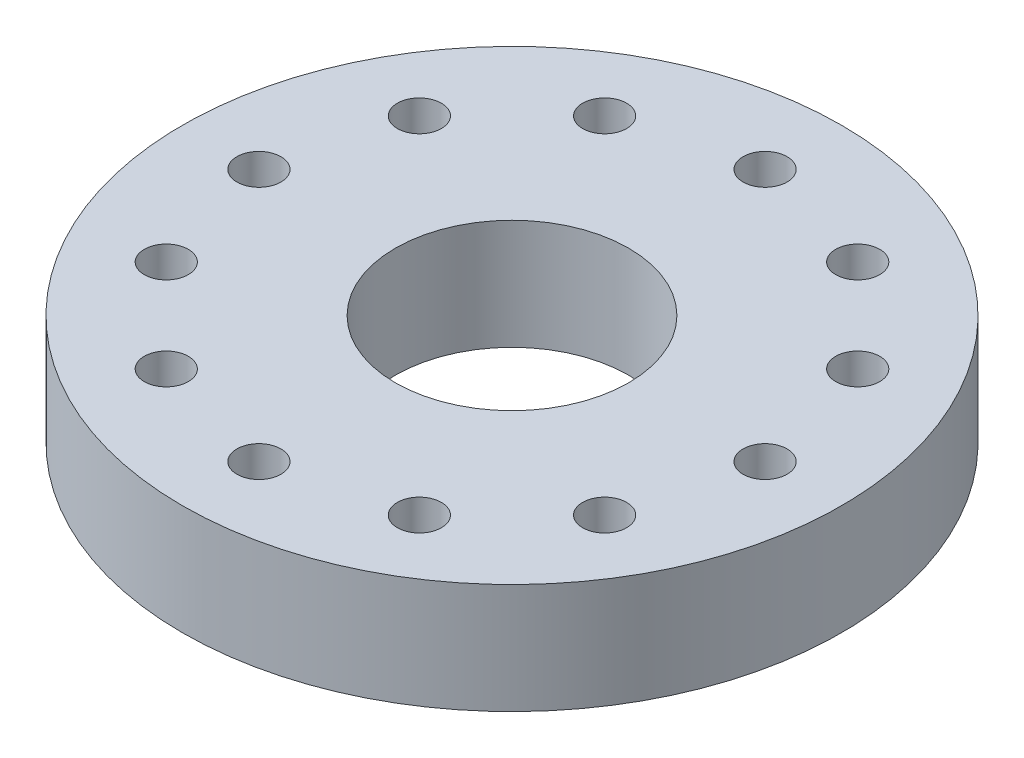
ISO-10303-21;
HEADER;
FILE_DESCRIPTION(('STEP AP214'),'2;1');
FILE_NAME('part.step','',(''),(''),'','','');
FILE_SCHEMA(('AUTOMOTIVE_DESIGN { 1 0 10303 214 1 1 1 1 }'));
ENDSEC;
DATA;
#1=APPLICATION_CONTEXT('core data for automotive mechanical design processes');
#2=APPLICATION_PROTOCOL_DEFINITION('international standard','automotive_design',2000,#1);
#3=PRODUCT_CONTEXT('',#1,'mechanical');
#4=PRODUCT('Part','Part','',(#3));
#5=PRODUCT_RELATED_PRODUCT_CATEGORY('part','',(#4));
#6=PRODUCT_DEFINITION_FORMATION('','',#4);
#7=PRODUCT_DEFINITION_CONTEXT('part definition',#1,'design');
#8=PRODUCT_DEFINITION('design','',#6,#7);
#9=PRODUCT_DEFINITION_SHAPE('','',#8);
#10=(LENGTH_UNIT() NAMED_UNIT(*) SI_UNIT(.MILLI.,.METRE.));
#11=(NAMED_UNIT(*) PLANE_ANGLE_UNIT() SI_UNIT($,.RADIAN.));
#12=(NAMED_UNIT(*) SI_UNIT($,.STERADIAN.) SOLID_ANGLE_UNIT());
#13=UNCERTAINTY_MEASURE_WITH_UNIT(LENGTH_MEASURE(1.E-05),#10,'distance_accuracy_value','');
#14=(GEOMETRIC_REPRESENTATION_CONTEXT(3) GLOBAL_UNCERTAINTY_ASSIGNED_CONTEXT((#13)) GLOBAL_UNIT_ASSIGNED_CONTEXT((#10,
#11,#12)) REPRESENTATION_CONTEXT('',''));
#15=CARTESIAN_POINT('',(0.,0.,0.));
#16=DIRECTION('',(0.,0.,1.));
#17=DIRECTION('',(1.,0.,0.));
#18=AXIS2_PLACEMENT_3D('',#15,#16,#17);
#19=CARTESIAN_POINT('',(0.,10.,0.));
#20=DIRECTION('',(0.,1.,0.));
#21=DIRECTION('',(0.,0.,1.));
#22=AXIS2_PLACEMENT_3D('',#19,#20,#21);
#23=PLANE('',#22);
#24=CARTESIAN_POINT('',(-19.9185842870416,10.,-11.499999999999));
#25=DIRECTION('',(0.,1.,0.));
#26=DIRECTION('',(0.,0.,1.));
#27=AXIS2_PLACEMENT_3D('',#24,#25,#26);
#28=CIRCLE('',#27,2.);
#29=CARTESIAN_POINT('',(-19.9185842870416,10.,-9.49999999999905));
#30=VERTEX_POINT('',#29);
#31=EDGE_CURVE('E107',#30,#30,#28,.T.);
#32=ORIENTED_EDGE('',*,*,#31,.F.);
#33=EDGE_LOOP('',(#32));
#34=FACE_BOUND('',#33,.T.);
#35=CARTESIAN_POINT('',(-19.9185842870405,10.,11.5000000000009));
#36=DIRECTION('',(0.,1.,0.));
#37=DIRECTION('',(0.,0.,1.));
#38=AXIS2_PLACEMENT_3D('',#35,#36,#37);
#39=CIRCLE('',#38,2.);
#40=CARTESIAN_POINT('',(-19.9185842870405,10.,13.5000000000009));
#41=VERTEX_POINT('',#40);
#42=EDGE_CURVE('E95',#41,#41,#39,.T.);
#43=ORIENTED_EDGE('',*,*,#42,.F.);
#44=EDGE_LOOP('',(#43));
#45=FACE_BOUND('',#44,.T.);
#46=CARTESIAN_POINT('',(2.16458606171264E-12,10.,23.));
#47=DIRECTION('',(0.,1.,0.));
#48=DIRECTION('',(0.,0.,1.));
#49=AXIS2_PLACEMENT_3D('',#46,#47,#48);
#50=CIRCLE('',#49,2.);
#51=CARTESIAN_POINT('',(2.16458606171264E-12,10.,25.));
#52=VERTEX_POINT('',#51);
#53=EDGE_CURVE('E83',#52,#52,#50,.T.);
#54=ORIENTED_EDGE('',*,*,#53,.F.);
#55=EDGE_LOOP('',(#54));
#56=FACE_BOUND('',#55,.T.);
#57=CARTESIAN_POINT('',(19.9185842870437,10.,11.4999999999991));
#58=DIRECTION('',(0.,1.,0.));
#59=DIRECTION('',(0.,0.,1.));
#60=AXIS2_PLACEMENT_3D('',#57,#58,#59);
#61=CIRCLE('',#60,2.);
#62=CARTESIAN_POINT('',(19.9185842870437,10.,13.4999999999991));
#63=VERTEX_POINT('',#62);
#64=EDGE_CURVE('E71',#63,#63,#61,.T.);
#65=ORIENTED_EDGE('',*,*,#64,.F.);
#66=EDGE_LOOP('',(#65));
#67=FACE_BOUND('',#66,.T.);
#68=CARTESIAN_POINT('',(19.9185842870426,10.,-11.5000000000009));
#69=DIRECTION('',(0.,1.,0.));
#70=DIRECTION('',(0.,0.,1.));
#71=AXIS2_PLACEMENT_3D('',#68,#69,#70);
#72=CIRCLE('',#71,2.);
#73=CARTESIAN_POINT('',(19.9185842870426,10.,-9.50000000000093));
#74=VERTEX_POINT('',#73);
#75=EDGE_CURVE('E59',#74,#74,#72,.T.);
#76=ORIENTED_EDGE('',*,*,#75,.F.);
#77=EDGE_LOOP('',(#76));
#78=FACE_BOUND('',#77,.T.);
#79=CARTESIAN_POINT('',(0.,10.,0.));
#80=DIRECTION('',(0.,1.,0.));
#81=DIRECTION('',(0.,0.,1.));
#82=AXIS2_PLACEMENT_3D('',#79,#80,#81);
#83=CIRCLE('',#82,10.6);
#84=CARTESIAN_POINT('',(0.,10.,10.6));
#85=VERTEX_POINT('',#84);
#86=EDGE_CURVE('E47',#85,#85,#83,.T.);
#87=ORIENTED_EDGE('',*,*,#86,.F.);
#88=EDGE_LOOP('',(#87));
#89=FACE_BOUND('',#88,.T.);
#90=CARTESIAN_POINT('',(0.,10.,0.));
#91=DIRECTION('',(0.,1.,0.));
#92=DIRECTION('',(0.,0.,1.));
#93=AXIS2_PLACEMENT_3D('',#90,#91,#92);
#94=CIRCLE('',#93,29.95);
#95=CARTESIAN_POINT('',(0.,10.,29.95));
#96=VERTEX_POINT('',#95);
#97=EDGE_CURVE('E10',#96,#96,#94,.T.);
#98=ORIENTED_EDGE('',*,*,#97,.T.);
#99=EDGE_LOOP('',(#98));
#100=FACE_BOUND('',#99,.T.);
#101=CARTESIAN_POINT('',(0.,10.,-23.));
#102=DIRECTION('',(0.,1.,0.));
#103=DIRECTION('',(0.,0.,1.));
#104=AXIS2_PLACEMENT_3D('',#101,#102,#103);
#105=CIRCLE('',#104,2.);
#106=CARTESIAN_POINT('',(0.,10.,-21.));
#107=VERTEX_POINT('',#106);
#108=EDGE_CURVE('E42',#107,#107,#105,.T.);
#109=ORIENTED_EDGE('',*,*,#108,.F.);
#110=EDGE_LOOP('',(#109));
#111=FACE_BOUND('',#110,.T.);
#112=CARTESIAN_POINT('',(11.5000000000003,10.,-19.918584287043));
#113=DIRECTION('',(0.,1.,0.));
#114=DIRECTION('',(0.,0.,1.));
#115=AXIS2_PLACEMENT_3D('',#112,#113,#114);
#116=CIRCLE('',#115,2.);
#117=CARTESIAN_POINT('',(11.5000000000003,10.,-17.918584287043));
#118=VERTEX_POINT('',#117);
#119=EDGE_CURVE('E53',#118,#118,#116,.T.);
#120=ORIENTED_EDGE('',*,*,#119,.F.);
#121=EDGE_LOOP('',(#120));
#122=FACE_BOUND('',#121,.T.);
#123=CARTESIAN_POINT('',(23.0000000000011,10.,-1.08229303085632E-12));
#124=DIRECTION('',(0.,1.,0.));
#125=DIRECTION('',(0.,0.,1.));
#126=AXIS2_PLACEMENT_3D('',#123,#124,#125);
#127=CIRCLE('',#126,2.);
#128=CARTESIAN_POINT('',(23.0000000000011,10.,1.99999999999892));
#129=VERTEX_POINT('',#128);
#130=EDGE_CURVE('E65',#129,#129,#127,.T.);
#131=ORIENTED_EDGE('',*,*,#130,.F.);
#132=EDGE_LOOP('',(#131));
#133=FACE_BOUND('',#132,.T.);
#134=CARTESIAN_POINT('',(11.500000000002,10.,19.9185842870415));
#135=DIRECTION('',(0.,1.,0.));
#136=DIRECTION('',(0.,0.,1.));
#137=AXIS2_PLACEMENT_3D('',#134,#135,#136);
#138=CIRCLE('',#137,2.);
#139=CARTESIAN_POINT('',(11.500000000002,10.,21.9185842870415));
#140=VERTEX_POINT('',#139);
#141=EDGE_CURVE('E77',#140,#140,#138,.T.);
#142=ORIENTED_EDGE('',*,*,#141,.F.);
#143=EDGE_LOOP('',(#142));
#144=FACE_BOUND('',#143,.T.);
#145=CARTESIAN_POINT('',(-11.499999999998,10.,19.9185842870426));
#146=DIRECTION('',(0.,1.,0.));
#147=DIRECTION('',(0.,0.,1.));
#148=AXIS2_PLACEMENT_3D('',#145,#146,#147);
#149=CIRCLE('',#148,2.);
#150=CARTESIAN_POINT('',(-11.499999999998,10.,21.9185842870426));
#151=VERTEX_POINT('',#150);
#152=EDGE_CURVE('E89',#151,#151,#149,.T.);
#153=ORIENTED_EDGE('',*,*,#152,.F.);
#154=EDGE_LOOP('',(#153));
#155=FACE_BOUND('',#154,.T.);
#156=CARTESIAN_POINT('',(-22.9999999999989,10.,1.08510971849436E-12));
#157=DIRECTION('',(0.,1.,0.));
#158=DIRECTION('',(0.,0.,1.));
#159=AXIS2_PLACEMENT_3D('',#156,#157,#158);
#160=CIRCLE('',#159,2.);
#161=CARTESIAN_POINT('',(-22.9999999999989,10.,2.00000000000109));
#162=VERTEX_POINT('',#161);
#163=EDGE_CURVE('E101',#162,#162,#160,.T.);
#164=ORIENTED_EDGE('',*,*,#163,.F.);
#165=EDGE_LOOP('',(#164));
#166=FACE_BOUND('',#165,.T.);
#167=CARTESIAN_POINT('',(-11.4999999999999,10.,-19.9185842870415));
#168=DIRECTION('',(0.,1.,0.));
#169=DIRECTION('',(0.,0.,1.));
#170=AXIS2_PLACEMENT_3D('',#167,#168,#169);
#171=CIRCLE('',#170,2.);
#172=CARTESIAN_POINT('',(-11.4999999999999,10.,-17.9185842870415));
#173=VERTEX_POINT('',#172);
#174=EDGE_CURVE('E113',#173,#173,#171,.T.);
#175=ORIENTED_EDGE('',*,*,#174,.F.);
#176=EDGE_LOOP('',(#175));
#177=FACE_BOUND('',#176,.T.);
#178=ADVANCED_FACE('F31',(#34,#45,#56,#67,#78,#89,#100,#111,#122,#133,#144,#155,#166,#177),#23,.T.);
#179=CARTESIAN_POINT('',(0.,0.,0.));
#180=DIRECTION('',(0.,1.,0.));
#181=DIRECTION('',(0.,0.,1.));
#182=AXIS2_PLACEMENT_3D('',#179,#180,#181);
#183=PLANE('',#182);
#184=CARTESIAN_POINT('',(0.,0.,0.));
#185=DIRECTION('',(0.,1.,0.));
#186=DIRECTION('',(0.,0.,1.));
#187=AXIS2_PLACEMENT_3D('',#184,#185,#186);
#188=CIRCLE('',#187,29.95);
#189=CARTESIAN_POINT('',(0.,0.,29.95));
#190=VERTEX_POINT('',#189);
#191=EDGE_CURVE('E35',#190,#190,#188,.T.);
#192=ORIENTED_EDGE('',*,*,#191,.F.);
#193=EDGE_LOOP('',(#192));
#194=FACE_BOUND('',#193,.T.);
#195=CARTESIAN_POINT('',(0.,0.,-23.));
#196=DIRECTION('',(0.,1.,0.));
#197=DIRECTION('',(0.,0.,1.));
#198=AXIS2_PLACEMENT_3D('',#195,#196,#197);
#199=CIRCLE('',#198,2.);
#200=CARTESIAN_POINT('',(0.,0.,-21.));
#201=VERTEX_POINT('',#200);
#202=EDGE_CURVE('E44',#201,#201,#199,.T.);
#203=ORIENTED_EDGE('',*,*,#202,.T.);
#204=EDGE_LOOP('',(#203));
#205=FACE_BOUND('',#204,.T.);
#206=CARTESIAN_POINT('',(0.,0.,0.));
#207=DIRECTION('',(0.,1.,0.));
#208=DIRECTION('',(0.,0.,1.));
#209=AXIS2_PLACEMENT_3D('',#206,#207,#208);
#210=CIRCLE('',#209,10.6);
#211=CARTESIAN_POINT('',(0.,0.,10.6));
#212=VERTEX_POINT('',#211);
#213=EDGE_CURVE('E50',#212,#212,#210,.T.);
#214=ORIENTED_EDGE('',*,*,#213,.T.);
#215=EDGE_LOOP('',(#214));
#216=FACE_BOUND('',#215,.T.);
#217=CARTESIAN_POINT('',(11.5000000000003,0.,-19.918584287043));
#218=DIRECTION('',(0.,1.,0.));
#219=DIRECTION('',(0.,0.,1.));
#220=AXIS2_PLACEMENT_3D('',#217,#218,#219);
#221=CIRCLE('',#220,2.);
#222=CARTESIAN_POINT('',(11.5000000000003,0.,-17.918584287043));
#223=VERTEX_POINT('',#222);
#224=EDGE_CURVE('E56',#223,#223,#221,.T.);
#225=ORIENTED_EDGE('',*,*,#224,.T.);
#226=EDGE_LOOP('',(#225));
#227=FACE_BOUND('',#226,.T.);
#228=CARTESIAN_POINT('',(19.9185842870426,0.,-11.5000000000009));
#229=DIRECTION('',(0.,1.,0.));
#230=DIRECTION('',(0.,0.,1.));
#231=AXIS2_PLACEMENT_3D('',#228,#229,#230);
#232=CIRCLE('',#231,2.);
#233=CARTESIAN_POINT('',(19.9185842870426,0.,-9.50000000000093));
#234=VERTEX_POINT('',#233);
#235=EDGE_CURVE('E62',#234,#234,#232,.T.);
#236=ORIENTED_EDGE('',*,*,#235,.T.);
#237=EDGE_LOOP('',(#236));
#238=FACE_BOUND('',#237,.T.);
#239=CARTESIAN_POINT('',(23.0000000000011,0.,-1.08229303085632E-12));
#240=DIRECTION('',(0.,1.,0.));
#241=DIRECTION('',(0.,0.,1.));
#242=AXIS2_PLACEMENT_3D('',#239,#240,#241);
#243=CIRCLE('',#242,2.);
#244=CARTESIAN_POINT('',(23.0000000000011,0.,1.99999999999892));
#245=VERTEX_POINT('',#244);
#246=EDGE_CURVE('E68',#245,#245,#243,.T.);
#247=ORIENTED_EDGE('',*,*,#246,.T.);
#248=EDGE_LOOP('',(#247));
#249=FACE_BOUND('',#248,.T.);
#250=CARTESIAN_POINT('',(19.9185842870437,0.,11.4999999999991));
#251=DIRECTION('',(0.,1.,0.));
#252=DIRECTION('',(0.,0.,1.));
#253=AXIS2_PLACEMENT_3D('',#250,#251,#252);
#254=CIRCLE('',#253,2.);
#255=CARTESIAN_POINT('',(19.9185842870437,0.,13.4999999999991));
#256=VERTEX_POINT('',#255);
#257=EDGE_CURVE('E74',#256,#256,#254,.T.);
#258=ORIENTED_EDGE('',*,*,#257,.T.);
#259=EDGE_LOOP('',(#258));
#260=FACE_BOUND('',#259,.T.);
#261=CARTESIAN_POINT('',(11.500000000002,0.,19.9185842870415));
#262=DIRECTION('',(0.,1.,0.));
#263=DIRECTION('',(0.,0.,1.));
#264=AXIS2_PLACEMENT_3D('',#261,#262,#263);
#265=CIRCLE('',#264,2.);
#266=CARTESIAN_POINT('',(11.500000000002,0.,21.9185842870415));
#267=VERTEX_POINT('',#266);
#268=EDGE_CURVE('E80',#267,#267,#265,.T.);
#269=ORIENTED_EDGE('',*,*,#268,.T.);
#270=EDGE_LOOP('',(#269));
#271=FACE_BOUND('',#270,.T.);
#272=CARTESIAN_POINT('',(2.16458606171264E-12,0.,23.));
#273=DIRECTION('',(0.,1.,0.));
#274=DIRECTION('',(0.,0.,1.));
#275=AXIS2_PLACEMENT_3D('',#272,#273,#274);
#276=CIRCLE('',#275,2.);
#277=CARTESIAN_POINT('',(2.16458606171264E-12,0.,25.));
#278=VERTEX_POINT('',#277);
#279=EDGE_CURVE('E86',#278,#278,#276,.T.);
#280=ORIENTED_EDGE('',*,*,#279,.T.);
#281=EDGE_LOOP('',(#280));
#282=FACE_BOUND('',#281,.T.);
#283=CARTESIAN_POINT('',(-11.499999999998,0.,19.9185842870426));
#284=DIRECTION('',(0.,1.,0.));
#285=DIRECTION('',(0.,0.,1.));
#286=AXIS2_PLACEMENT_3D('',#283,#284,#285);
#287=CIRCLE('',#286,2.);
#288=CARTESIAN_POINT('',(-11.499999999998,0.,21.9185842870426));
#289=VERTEX_POINT('',#288);
#290=EDGE_CURVE('E92',#289,#289,#287,.T.);
#291=ORIENTED_EDGE('',*,*,#290,.T.);
#292=EDGE_LOOP('',(#291));
#293=FACE_BOUND('',#292,.T.);
#294=CARTESIAN_POINT('',(-19.9185842870405,0.,11.5000000000009));
#295=DIRECTION('',(0.,1.,0.));
#296=DIRECTION('',(0.,0.,1.));
#297=AXIS2_PLACEMENT_3D('',#294,#295,#296);
#298=CIRCLE('',#297,2.);
#299=CARTESIAN_POINT('',(-19.9185842870405,0.,13.5000000000009));
#300=VERTEX_POINT('',#299);
#301=EDGE_CURVE('E98',#300,#300,#298,.T.);
#302=ORIENTED_EDGE('',*,*,#301,.T.);
#303=EDGE_LOOP('',(#302));
#304=FACE_BOUND('',#303,.T.);
#305=CARTESIAN_POINT('',(-22.9999999999989,0.,1.08510971849436E-12));
#306=DIRECTION('',(0.,1.,0.));
#307=DIRECTION('',(0.,0.,1.));
#308=AXIS2_PLACEMENT_3D('',#305,#306,#307);
#309=CIRCLE('',#308,2.);
#310=CARTESIAN_POINT('',(-22.9999999999989,0.,2.00000000000109));
#311=VERTEX_POINT('',#310);
#312=EDGE_CURVE('E104',#311,#311,#309,.T.);
#313=ORIENTED_EDGE('',*,*,#312,.T.);
#314=EDGE_LOOP('',(#313));
#315=FACE_BOUND('',#314,.T.);
#316=CARTESIAN_POINT('',(-19.9185842870416,0.,-11.499999999999));
#317=DIRECTION('',(0.,1.,0.));
#318=DIRECTION('',(0.,0.,1.));
#319=AXIS2_PLACEMENT_3D('',#316,#317,#318);
#320=CIRCLE('',#319,2.);
#321=CARTESIAN_POINT('',(-19.9185842870416,0.,-9.49999999999905));
#322=VERTEX_POINT('',#321);
#323=EDGE_CURVE('E110',#322,#322,#320,.T.);
#324=ORIENTED_EDGE('',*,*,#323,.T.);
#325=EDGE_LOOP('',(#324));
#326=FACE_BOUND('',#325,.T.);
#327=CARTESIAN_POINT('',(-11.4999999999999,0.,-19.9185842870415));
#328=DIRECTION('',(0.,1.,0.));
#329=DIRECTION('',(0.,0.,1.));
#330=AXIS2_PLACEMENT_3D('',#327,#328,#329);
#331=CIRCLE('',#330,2.);
#332=CARTESIAN_POINT('',(-11.4999999999999,0.,-17.9185842870415));
#333=VERTEX_POINT('',#332);
#334=EDGE_CURVE('E116',#333,#333,#331,.T.);
#335=ORIENTED_EDGE('',*,*,#334,.T.);
#336=EDGE_LOOP('',(#335));
#337=FACE_BOUND('',#336,.T.);
#338=ADVANCED_FACE('F126',(#194,#205,#216,#227,#238,#249,#260,#271,#282,#293,#304,#315,#326,
#337),#183,.F.);
#339=CARTESIAN_POINT('',(0.,10.,0.));
#340=DIRECTION('',(0.,-1.,0.));
#341=DIRECTION('',(0.,0.,-1.));
#342=AXIS2_PLACEMENT_3D('',#339,#340,#341);
#343=CYLINDRICAL_SURFACE('',#342,29.95);
#344=ORIENTED_EDGE('',*,*,#97,.F.);
#345=EDGE_LOOP('',(#344));
#346=FACE_BOUND('',#345,.T.);
#347=ORIENTED_EDGE('',*,*,#191,.T.);
#348=EDGE_LOOP('',(#347));
#349=FACE_BOUND('',#348,.T.);
#350=ADVANCED_FACE('F33',(#346,#349),#343,.T.);
#351=CARTESIAN_POINT('',(0.,10.,-23.));
#352=DIRECTION('',(0.,-1.,0.));
#353=DIRECTION('',(0.,0.,-1.));
#354=AXIS2_PLACEMENT_3D('',#351,#352,#353);
#355=CYLINDRICAL_SURFACE('',#354,2.);
#356=ORIENTED_EDGE('',*,*,#108,.T.);
#357=EDGE_LOOP('',(#356));
#358=FACE_BOUND('',#357,.T.);
#359=ORIENTED_EDGE('',*,*,#202,.F.);
#360=EDGE_LOOP('',(#359));
#361=FACE_BOUND('',#360,.T.);
#362=ADVANCED_FACE('F136',(#358,#361),#355,.F.);
#363=CARTESIAN_POINT('',(0.,10.,0.));
#364=DIRECTION('',(0.,-1.,0.));
#365=DIRECTION('',(0.,0.,-1.));
#366=AXIS2_PLACEMENT_3D('',#363,#364,#365);
#367=CYLINDRICAL_SURFACE('',#366,10.6);
#368=ORIENTED_EDGE('',*,*,#86,.T.);
#369=EDGE_LOOP('',(#368));
#370=FACE_BOUND('',#369,.T.);
#371=ORIENTED_EDGE('',*,*,#213,.F.);
#372=EDGE_LOOP('',(#371));
#373=FACE_BOUND('',#372,.T.);
#374=ADVANCED_FACE('F139',(#370,#373),#367,.F.);
#375=CARTESIAN_POINT('',(11.5000000000003,10.,-19.918584287043));
#376=DIRECTION('',(0.,-1.,0.));
#377=DIRECTION('',(0.,0.,-1.));
#378=AXIS2_PLACEMENT_3D('',#375,#376,#377);
#379=CYLINDRICAL_SURFACE('',#378,2.);
#380=ORIENTED_EDGE('',*,*,#119,.T.);
#381=EDGE_LOOP('',(#380));
#382=FACE_BOUND('',#381,.T.);
#383=ORIENTED_EDGE('',*,*,#224,.F.);
#384=EDGE_LOOP('',(#383));
#385=FACE_BOUND('',#384,.T.);
#386=ADVANCED_FACE('F143',(#382,#385),#379,.F.);
#387=CARTESIAN_POINT('',(19.9185842870426,10.,-11.5000000000009));
#388=DIRECTION('',(0.,-1.,0.));
#389=DIRECTION('',(0.,0.,-1.));
#390=AXIS2_PLACEMENT_3D('',#387,#388,#389);
#391=CYLINDRICAL_SURFACE('',#390,2.);
#392=ORIENTED_EDGE('',*,*,#75,.T.);
#393=EDGE_LOOP('',(#392));
#394=FACE_BOUND('',#393,.T.);
#395=ORIENTED_EDGE('',*,*,#235,.F.);
#396=EDGE_LOOP('',(#395));
#397=FACE_BOUND('',#396,.T.);
#398=ADVANCED_FACE('F147',(#394,#397),#391,.F.);
#399=CARTESIAN_POINT('',(23.0000000000011,10.,-1.08229303085632E-12));
#400=DIRECTION('',(0.,-1.,0.));
#401=DIRECTION('',(0.,0.,-1.));
#402=AXIS2_PLACEMENT_3D('',#399,#400,#401);
#403=CYLINDRICAL_SURFACE('',#402,2.);
#404=ORIENTED_EDGE('',*,*,#130,.T.);
#405=EDGE_LOOP('',(#404));
#406=FACE_BOUND('',#405,.T.);
#407=ORIENTED_EDGE('',*,*,#246,.F.);
#408=EDGE_LOOP('',(#407));
#409=FACE_BOUND('',#408,.T.);
#410=ADVANCED_FACE('F151',(#406,#409),#403,.F.);
#411=CARTESIAN_POINT('',(19.9185842870437,10.,11.4999999999991));
#412=DIRECTION('',(0.,-1.,0.));
#413=DIRECTION('',(0.,0.,-1.));
#414=AXIS2_PLACEMENT_3D('',#411,#412,#413);
#415=CYLINDRICAL_SURFACE('',#414,2.);
#416=ORIENTED_EDGE('',*,*,#64,.T.);
#417=EDGE_LOOP('',(#416));
#418=FACE_BOUND('',#417,.T.);
#419=ORIENTED_EDGE('',*,*,#257,.F.);
#420=EDGE_LOOP('',(#419));
#421=FACE_BOUND('',#420,.T.);
#422=ADVANCED_FACE('F155',(#418,#421),#415,.F.);
#423=CARTESIAN_POINT('',(11.500000000002,10.,19.9185842870415));
#424=DIRECTION('',(0.,-1.,0.));
#425=DIRECTION('',(0.,0.,-1.));
#426=AXIS2_PLACEMENT_3D('',#423,#424,#425);
#427=CYLINDRICAL_SURFACE('',#426,2.);
#428=ORIENTED_EDGE('',*,*,#141,.T.);
#429=EDGE_LOOP('',(#428));
#430=FACE_BOUND('',#429,.T.);
#431=ORIENTED_EDGE('',*,*,#268,.F.);
#432=EDGE_LOOP('',(#431));
#433=FACE_BOUND('',#432,.T.);
#434=ADVANCED_FACE('F159',(#430,#433),#427,.F.);
#435=CARTESIAN_POINT('',(2.16458606171264E-12,10.,23.));
#436=DIRECTION('',(0.,-1.,0.));
#437=DIRECTION('',(0.,0.,-1.));
#438=AXIS2_PLACEMENT_3D('',#435,#436,#437);
#439=CYLINDRICAL_SURFACE('',#438,2.);
#440=ORIENTED_EDGE('',*,*,#53,.T.);
#441=EDGE_LOOP('',(#440));
#442=FACE_BOUND('',#441,.T.);
#443=ORIENTED_EDGE('',*,*,#279,.F.);
#444=EDGE_LOOP('',(#443));
#445=FACE_BOUND('',#444,.T.);
#446=ADVANCED_FACE('F163',(#442,#445),#439,.F.);
#447=CARTESIAN_POINT('',(-11.499999999998,10.,19.9185842870426));
#448=DIRECTION('',(0.,-1.,0.));
#449=DIRECTION('',(0.,0.,-1.));
#450=AXIS2_PLACEMENT_3D('',#447,#448,#449);
#451=CYLINDRICAL_SURFACE('',#450,2.);
#452=ORIENTED_EDGE('',*,*,#152,.T.);
#453=EDGE_LOOP('',(#452));
#454=FACE_BOUND('',#453,.T.);
#455=ORIENTED_EDGE('',*,*,#290,.F.);
#456=EDGE_LOOP('',(#455));
#457=FACE_BOUND('',#456,.T.);
#458=ADVANCED_FACE('F167',(#454,#457),#451,.F.);
#459=CARTESIAN_POINT('',(-19.9185842870405,10.,11.5000000000009));
#460=DIRECTION('',(0.,-1.,0.));
#461=DIRECTION('',(0.,0.,-1.));
#462=AXIS2_PLACEMENT_3D('',#459,#460,#461);
#463=CYLINDRICAL_SURFACE('',#462,2.);
#464=ORIENTED_EDGE('',*,*,#42,.T.);
#465=EDGE_LOOP('',(#464));
#466=FACE_BOUND('',#465,.T.);
#467=ORIENTED_EDGE('',*,*,#301,.F.);
#468=EDGE_LOOP('',(#467));
#469=FACE_BOUND('',#468,.T.);
#470=ADVANCED_FACE('F171',(#466,#469),#463,.F.);
#471=CARTESIAN_POINT('',(-22.9999999999989,10.,1.08510971849436E-12));
#472=DIRECTION('',(0.,-1.,0.));
#473=DIRECTION('',(0.,0.,-1.));
#474=AXIS2_PLACEMENT_3D('',#471,#472,#473);
#475=CYLINDRICAL_SURFACE('',#474,2.);
#476=ORIENTED_EDGE('',*,*,#163,.T.);
#477=EDGE_LOOP('',(#476));
#478=FACE_BOUND('',#477,.T.);
#479=ORIENTED_EDGE('',*,*,#312,.F.);
#480=EDGE_LOOP('',(#479));
#481=FACE_BOUND('',#480,.T.);
#482=ADVANCED_FACE('F175',(#478,#481),#475,.F.);
#483=CARTESIAN_POINT('',(-19.9185842870416,10.,-11.499999999999));
#484=DIRECTION('',(0.,-1.,0.));
#485=DIRECTION('',(0.,0.,-1.));
#486=AXIS2_PLACEMENT_3D('',#483,#484,#485);
#487=CYLINDRICAL_SURFACE('',#486,2.);
#488=ORIENTED_EDGE('',*,*,#31,.T.);
#489=EDGE_LOOP('',(#488));
#490=FACE_BOUND('',#489,.T.);
#491=ORIENTED_EDGE('',*,*,#323,.F.);
#492=EDGE_LOOP('',(#491));
#493=FACE_BOUND('',#492,.T.);
#494=ADVANCED_FACE('F179',(#490,#493),#487,.F.);
#495=CARTESIAN_POINT('',(-11.4999999999999,10.,-19.9185842870415));
#496=DIRECTION('',(0.,-1.,0.));
#497=DIRECTION('',(0.,0.,-1.));
#498=AXIS2_PLACEMENT_3D('',#495,#496,#497);
#499=CYLINDRICAL_SURFACE('',#498,2.);
#500=ORIENTED_EDGE('',*,*,#174,.T.);
#501=EDGE_LOOP('',(#500));
#502=FACE_BOUND('',#501,.T.);
#503=ORIENTED_EDGE('',*,*,#334,.F.);
#504=EDGE_LOOP('',(#503));
#505=FACE_BOUND('',#504,.T.);
#506=ADVANCED_FACE('F122',(#502,#505),#499,.F.);
#507=CLOSED_SHELL('',(#178,#338,#350,#362,#374,#386,#398,#410,#422,#434,#446,#458,#470,#482,
#494,#506));
#508=MANIFOLD_SOLID_BREP('B2',#507);
#509=ADVANCED_BREP_SHAPE_REPRESENTATION('',(#18,#508),#14);
#510=SHAPE_DEFINITION_REPRESENTATION(#9,#509);
ENDSEC;
END-ISO-10303-21;
